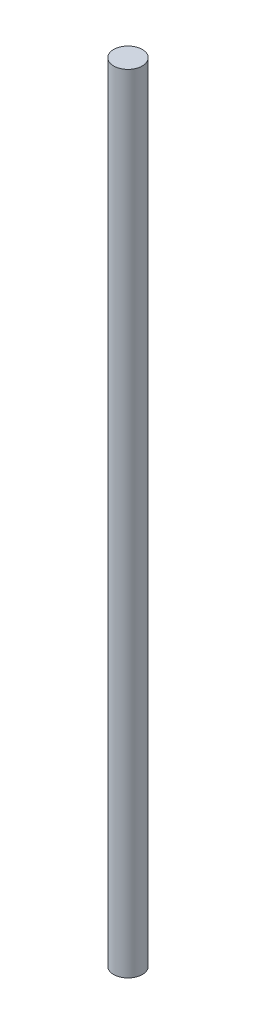
ISO-10303-21;
HEADER;
FILE_DESCRIPTION(('STEP AP214'),'2;1');
FILE_NAME('part.step','',(''),(''),'','','');
FILE_SCHEMA(('AUTOMOTIVE_DESIGN { 1 0 10303 214 1 1 1 1 }'));
ENDSEC;
DATA;
#1=APPLICATION_CONTEXT('core data for automotive mechanical design processes');
#2=APPLICATION_PROTOCOL_DEFINITION('international standard','automotive_design',2000,#1);
#3=PRODUCT_CONTEXT('',#1,'mechanical');
#4=PRODUCT('Part','Part','',(#3));
#5=PRODUCT_RELATED_PRODUCT_CATEGORY('part','',(#4));
#6=PRODUCT_DEFINITION_FORMATION('','',#4);
#7=PRODUCT_DEFINITION_CONTEXT('part definition',#1,'design');
#8=PRODUCT_DEFINITION('design','',#6,#7);
#9=PRODUCT_DEFINITION_SHAPE('','',#8);
#10=(LENGTH_UNIT() NAMED_UNIT(*) SI_UNIT(.MILLI.,.METRE.));
#11=(NAMED_UNIT(*) PLANE_ANGLE_UNIT() SI_UNIT($,.RADIAN.));
#12=(NAMED_UNIT(*) SI_UNIT($,.STERADIAN.) SOLID_ANGLE_UNIT());
#13=UNCERTAINTY_MEASURE_WITH_UNIT(LENGTH_MEASURE(1.E-05),#10,'distance_accuracy_value','');
#14=(GEOMETRIC_REPRESENTATION_CONTEXT(3) GLOBAL_UNCERTAINTY_ASSIGNED_CONTEXT((#13)) GLOBAL_UNIT_ASSIGNED_CONTEXT((#10,
#11,#12)) REPRESENTATION_CONTEXT('',''));
#15=CARTESIAN_POINT('',(0.,0.,0.));
#16=DIRECTION('',(0.,0.,1.));
#17=DIRECTION('',(1.,0.,0.));
#18=AXIS2_PLACEMENT_3D('',#15,#16,#17);
#19=CARTESIAN_POINT('',(0.,275.,0.));
#20=DIRECTION('',(0.,-1.,0.));
#21=DIRECTION('',(0.,0.,-1.));
#22=AXIS2_PLACEMENT_3D('',#19,#20,#21);
#23=CYLINDRICAL_SURFACE('',#22,5.005);
#24=CARTESIAN_POINT('',(0.,275.,0.));
#25=DIRECTION('',(0.,1.,0.));
#26=DIRECTION('',(0.,0.,1.));
#27=AXIS2_PLACEMENT_3D('',#24,#25,#26);
#28=CIRCLE('',#27,5.005);
#29=CARTESIAN_POINT('',(0.,275.,5.005));
#30=VERTEX_POINT('',#29);
#31=EDGE_CURVE('E10',#30,#30,#28,.T.);
#32=ORIENTED_EDGE('',*,*,#31,.F.);
#33=EDGE_LOOP('',(#32));
#34=FACE_BOUND('',#33,.T.);
#35=CARTESIAN_POINT('',(0.,0.,0.));
#36=DIRECTION('',(0.,1.,0.));
#37=DIRECTION('',(0.,0.,1.));
#38=AXIS2_PLACEMENT_3D('',#35,#36,#37);
#39=CIRCLE('',#38,5.005);
#40=CARTESIAN_POINT('',(0.,0.,5.005));
#41=VERTEX_POINT('',#40);
#42=EDGE_CURVE('E46',#41,#41,#39,.T.);
#43=ORIENTED_EDGE('',*,*,#42,.T.);
#44=EDGE_LOOP('',(#43));
#45=FACE_BOUND('',#44,.T.);
#46=ADVANCED_FACE('F43',(#34,#45),#23,.T.);
#47=CARTESIAN_POINT('',(0.,275.,0.));
#48=DIRECTION('',(0.,1.,0.));
#49=DIRECTION('',(0.,0.,1.));
#50=AXIS2_PLACEMENT_3D('',#47,#48,#49);
#51=PLANE('',#50);
#52=ORIENTED_EDGE('',*,*,#31,.T.);
#53=EDGE_LOOP('',(#52));
#54=FACE_BOUND('',#53,.T.);
#55=ADVANCED_FACE('F60',(#54),#51,.T.);
#56=CARTESIAN_POINT('',(0.,0.,0.));
#57=DIRECTION('',(0.,1.,0.));
#58=DIRECTION('',(0.,0.,1.));
#59=AXIS2_PLACEMENT_3D('',#56,#57,#58);
#60=PLANE('',#59);
#61=ORIENTED_EDGE('',*,*,#42,.F.);
#62=EDGE_LOOP('',(#61));
#63=FACE_BOUND('',#62,.T.);
#64=ADVANCED_FACE('F58',(#63),#60,.F.);
#65=CLOSED_SHELL('',(#46,#55,#64));
#66=MANIFOLD_SOLID_BREP('B2',#65);
#67=ADVANCED_BREP_SHAPE_REPRESENTATION('',(#18,#66),#14);
#68=SHAPE_DEFINITION_REPRESENTATION(#9,#67);
ENDSEC;
END-ISO-10303-21;
